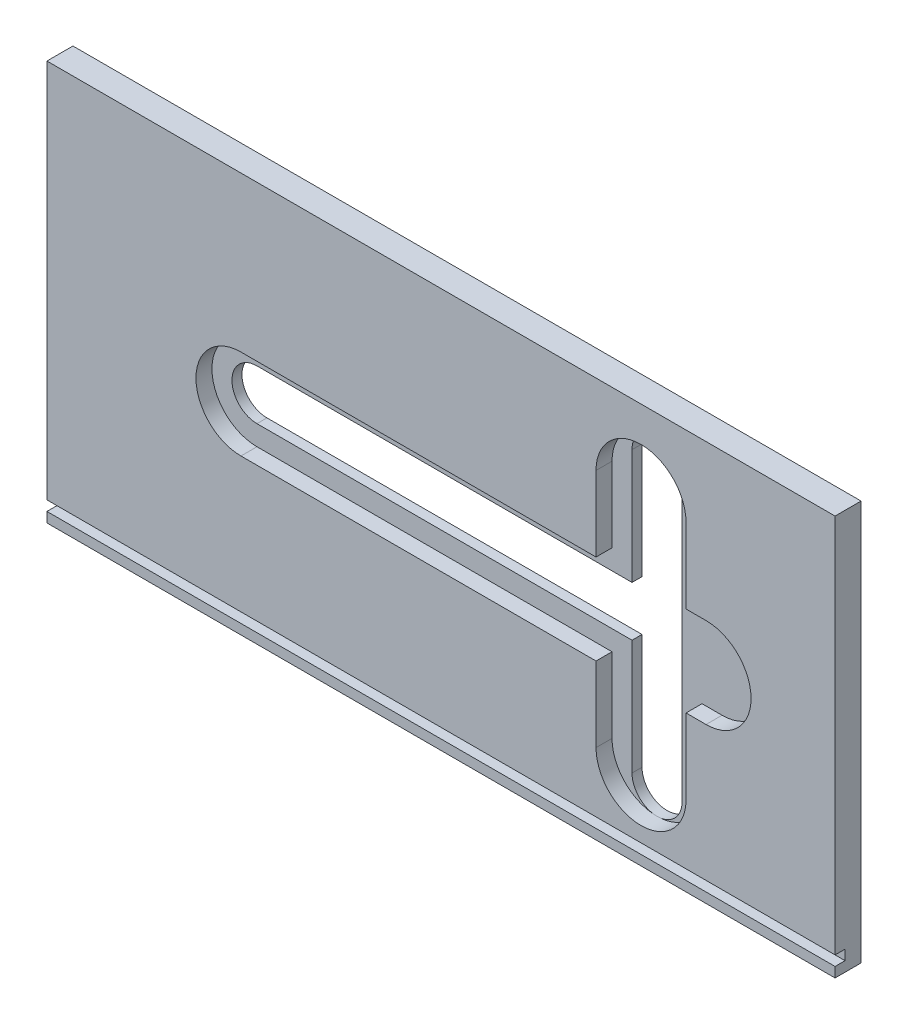
ISO-10303-21;
HEADER;
FILE_DESCRIPTION(('STEP AP214'),'2;1');
FILE_NAME('part.step','',(''),(''),'','','');
FILE_SCHEMA(('AUTOMOTIVE_DESIGN { 1 0 10303 214 1 1 1 1 }'));
ENDSEC;
DATA;
#1=APPLICATION_CONTEXT('core data for automotive mechanical design processes');
#2=APPLICATION_PROTOCOL_DEFINITION('international standard','automotive_design',2000,#1);
#3=PRODUCT_CONTEXT('',#1,'mechanical');
#4=PRODUCT('Part','Part','',(#3));
#5=PRODUCT_RELATED_PRODUCT_CATEGORY('part','',(#4));
#6=PRODUCT_DEFINITION_FORMATION('','',#4);
#7=PRODUCT_DEFINITION_CONTEXT('part definition',#1,'design');
#8=PRODUCT_DEFINITION('design','',#6,#7);
#9=PRODUCT_DEFINITION_SHAPE('','',#8);
#10=(LENGTH_UNIT() NAMED_UNIT(*) SI_UNIT(.MILLI.,.METRE.));
#11=(NAMED_UNIT(*) PLANE_ANGLE_UNIT() SI_UNIT($,.RADIAN.));
#12=(NAMED_UNIT(*) SI_UNIT($,.STERADIAN.) SOLID_ANGLE_UNIT());
#13=UNCERTAINTY_MEASURE_WITH_UNIT(LENGTH_MEASURE(1.E-05),#10,'distance_accuracy_value','');
#14=(GEOMETRIC_REPRESENTATION_CONTEXT(3) GLOBAL_UNCERTAINTY_ASSIGNED_CONTEXT((#13)) GLOBAL_UNIT_ASSIGNED_CONTEXT((#10,
#11,#12)) REPRESENTATION_CONTEXT('',''));
#15=CARTESIAN_POINT('',(0.,0.,0.));
#16=DIRECTION('',(0.,0.,1.));
#17=DIRECTION('',(1.,0.,0.));
#18=AXIS2_PLACEMENT_3D('',#15,#16,#17);
#19=CARTESIAN_POINT('',(27.7198682766191,61.5071428571429,0.));
#20=DIRECTION('',(0.,0.,1.));
#21=DIRECTION('',(1.,0.,0.));
#22=AXIS2_PLACEMENT_3D('',#19,#20,#21);
#23=CYLINDRICAL_SURFACE('',#22,12.5);
#24=CARTESIAN_POINT('',(27.7198682766191,61.5071428571429,5.));
#25=DIRECTION('',(0.,0.,1.));
#26=DIRECTION('',(1.,0.,0.));
#27=AXIS2_PLACEMENT_3D('',#24,#25,#26);
#28=CIRCLE('',#27,12.5);
#29=CARTESIAN_POINT('',(27.7198682766191,49.0071428571429,5.));
#30=VERTEX_POINT('',#29);
#31=CARTESIAN_POINT('',(27.7198682766191,74.0071428571429,5.));
#32=VERTEX_POINT('',#31);
#33=EDGE_CURVE('E330',#30,#32,#28,.F.);
#34=ORIENTED_EDGE('',*,*,#33,.F.);
#35=DIRECTION('',(0.,0.,1.));
#36=VECTOR('',#35,1.);
#37=CARTESIAN_POINT('',(27.7198682766191,49.0071428571429,0.));
#38=LINE('',#37,#36);
#39=CARTESIAN_POINT('',(27.7198682766191,49.0071428571429,0.));
#40=VERTEX_POINT('',#39);
#41=EDGE_CURVE('E366',#40,#30,#38,.T.);
#42=ORIENTED_EDGE('',*,*,#41,.F.);
#43=CARTESIAN_POINT('',(27.7198682766191,61.5071428571429,0.));
#44=DIRECTION('',(0.,0.,1.));
#45=DIRECTION('',(-1.,0.,0.));
#46=AXIS2_PLACEMENT_3D('',#43,#44,#45);
#47=CIRCLE('',#46,12.5);
#48=CARTESIAN_POINT('',(27.7198682766191,74.0071428571429,0.));
#49=VERTEX_POINT('',#48);
#50=EDGE_CURVE('E342',#49,#40,#47,.T.);
#51=ORIENTED_EDGE('',*,*,#50,.F.);
#52=DIRECTION('',(0.,0.,1.));
#53=VECTOR('',#52,1.);
#54=CARTESIAN_POINT('',(27.7198682766191,74.0071428571429,0.));
#55=LINE('',#54,#53);
#56=EDGE_CURVE('E367',#49,#32,#55,.T.);
#57=ORIENTED_EDGE('',*,*,#56,.T.);
#58=EDGE_LOOP('',(#34,#42,#51,#57));
#59=FACE_BOUND('',#58,.T.);
#60=ADVANCED_FACE('F33',(#59),#23,.F.);
#61=CARTESIAN_POINT('',(27.7198682766191,74.0071428571429,0.));
#62=DIRECTION('',(0.,1.,0.));
#63=DIRECTION('',(0.,0.,1.));
#64=AXIS2_PLACEMENT_3D('',#61,#62,#63);
#65=PLANE('',#64);
#66=DIRECTION('',(1.,0.,0.));
#67=VECTOR('',#66,1.);
#68=CARTESIAN_POINT('',(27.7198682766191,74.0071428571429,5.));
#69=LINE('',#68,#67);
#70=CARTESIAN_POINT('',(215.219868276619,74.0071428571429,5.));
#71=VERTEX_POINT('',#70);
#72=EDGE_CURVE('E337',#32,#71,#69,.T.);
#73=ORIENTED_EDGE('',*,*,#72,.F.);
#74=ORIENTED_EDGE('',*,*,#56,.F.);
#75=DIRECTION('',(-1.,0.,0.));
#76=VECTOR('',#75,1.);
#77=CARTESIAN_POINT('',(27.7198682766191,74.0071428571429,0.));
#78=LINE('',#77,#76);
#79=CARTESIAN_POINT('',(215.219868276619,74.0071428571429,0.));
#80=VERTEX_POINT('',#79);
#81=EDGE_CURVE('E363',#80,#49,#78,.T.);
#82=ORIENTED_EDGE('',*,*,#81,.F.);
#83=DIRECTION('',(0.,0.,1.));
#84=VECTOR('',#83,1.);
#85=CARTESIAN_POINT('',(215.219868276619,74.0071428571429,0.));
#86=LINE('',#85,#84);
#87=EDGE_CURVE('E371',#80,#71,#86,.T.);
#88=ORIENTED_EDGE('',*,*,#87,.T.);
#89=EDGE_LOOP('',(#73,#74,#82,#88));
#90=FACE_BOUND('',#89,.T.);
#91=ADVANCED_FACE('F499',(#90),#65,.F.);
#92=CARTESIAN_POINT('',(215.219868276619,131.507142857143,0.));
#93=DIRECTION('',(-1.,0.,0.));
#94=DIRECTION('',(0.,-1.,0.));
#95=AXIS2_PLACEMENT_3D('',#92,#93,#94);
#96=PLANE('',#95);
#97=DIRECTION('',(0.,1.,0.));
#98=VECTOR('',#97,1.);
#99=CARTESIAN_POINT('',(215.219868276619,131.507142857143,5.));
#100=LINE('',#99,#98);
#101=CARTESIAN_POINT('',(215.219868276619,131.507142857143,5.));
#102=VERTEX_POINT('',#101);
#103=EDGE_CURVE('E340',#71,#102,#100,.T.);
#104=ORIENTED_EDGE('',*,*,#103,.F.);
#105=ORIENTED_EDGE('',*,*,#87,.F.);
#106=DIRECTION('',(0.,-1.,0.));
#107=VECTOR('',#106,1.);
#108=CARTESIAN_POINT('',(215.219868276619,131.507142857143,0.));
#109=LINE('',#108,#107);
#110=CARTESIAN_POINT('',(215.219868276619,131.507142857143,0.));
#111=VERTEX_POINT('',#110);
#112=EDGE_CURVE('E360',#111,#80,#109,.T.);
#113=ORIENTED_EDGE('',*,*,#112,.F.);
#114=DIRECTION('',(0.,0.,1.));
#115=VECTOR('',#114,1.);
#116=CARTESIAN_POINT('',(215.219868276619,131.507142857143,0.));
#117=LINE('',#116,#115);
#118=EDGE_CURVE('E374',#111,#102,#117,.T.);
#119=ORIENTED_EDGE('',*,*,#118,.T.);
#120=EDGE_LOOP('',(#104,#105,#113,#119));
#121=FACE_BOUND('',#120,.T.);
#122=ADVANCED_FACE('F505',(#121),#96,.F.);
#123=CARTESIAN_POINT('',(227.719868276619,131.507142857143,0.));
#124=DIRECTION('',(0.,0.,1.));
#125=DIRECTION('',(1.,0.,0.));
#126=AXIS2_PLACEMENT_3D('',#123,#124,#125);
#127=CYLINDRICAL_SURFACE('',#126,12.5);
#128=CARTESIAN_POINT('',(227.719868276619,131.507142857143,5.));
#129=DIRECTION('',(0.,0.,1.));
#130=DIRECTION('',(1.,0.,0.));
#131=AXIS2_PLACEMENT_3D('',#128,#129,#130);
#132=CIRCLE('',#131,12.5);
#133=CARTESIAN_POINT('',(227.719868276619,144.007142857143,5.));
#134=VERTEX_POINT('',#133);
#135=CARTESIAN_POINT('',(240.219868276619,131.507142857143,5.));
#136=VERTEX_POINT('',#135);
#137=EDGE_CURVE('E335',#134,#136,#132,.F.);
#138=ORIENTED_EDGE('',*,*,#137,.F.);
#139=EDGE_CURVE('E338',#102,#134,#132,.F.);
#140=ORIENTED_EDGE('',*,*,#139,.F.);
#141=ORIENTED_EDGE('',*,*,#118,.F.);
#142=CARTESIAN_POINT('',(227.719868276619,131.507142857143,0.));
#143=DIRECTION('',(0.,0.,1.));
#144=DIRECTION('',(-1.,0.,0.));
#145=AXIS2_PLACEMENT_3D('',#142,#143,#144);
#146=CIRCLE('',#145,12.5);
#147=CARTESIAN_POINT('',(240.219868276619,131.507142857143,0.));
#148=VERTEX_POINT('',#147);
#149=EDGE_CURVE('E357',#148,#111,#146,.T.);
#150=ORIENTED_EDGE('',*,*,#149,.F.);
#151=DIRECTION('',(0.,0.,1.));
#152=VECTOR('',#151,1.);
#153=CARTESIAN_POINT('',(240.219868276619,131.507142857143,0.));
#154=LINE('',#153,#152);
#155=EDGE_CURVE('E377',#148,#136,#154,.T.);
#156=ORIENTED_EDGE('',*,*,#155,.T.);
#157=EDGE_LOOP('',(#138,#140,#141,#150,#156));
#158=FACE_BOUND('',#157,.T.);
#159=ADVANCED_FACE('F676',(#158),#127,.F.);
#160=CARTESIAN_POINT('',(240.219868276619,131.507142857143,0.));
#161=DIRECTION('',(1.,0.,0.));
#162=DIRECTION('',(0.,0.,-1.));
#163=AXIS2_PLACEMENT_3D('',#160,#161,#162);
#164=PLANE('',#163);
#165=DIRECTION('',(0.,-1.,0.));
#166=VECTOR('',#165,1.);
#167=CARTESIAN_POINT('',(240.219868276619,131.507142857143,5.));
#168=LINE('',#167,#166);
#169=CARTESIAN_POINT('',(240.219868276619,-8.49285714285714,5.));
#170=VERTEX_POINT('',#169);
#171=EDGE_CURVE('E333',#136,#170,#168,.T.);
#172=ORIENTED_EDGE('',*,*,#171,.F.);
#173=ORIENTED_EDGE('',*,*,#155,.F.);
#174=DIRECTION('',(0.,1.,0.));
#175=VECTOR('',#174,1.);
#176=CARTESIAN_POINT('',(240.219868276619,131.507142857143,0.));
#177=LINE('',#176,#175);
#178=CARTESIAN_POINT('',(240.219868276619,-8.49285714285713,0.));
#179=VERTEX_POINT('',#178);
#180=EDGE_CURVE('E354',#179,#148,#177,.T.);
#181=ORIENTED_EDGE('',*,*,#180,.F.);
#182=DIRECTION('',(0.,0.,1.));
#183=VECTOR('',#182,1.);
#184=CARTESIAN_POINT('',(240.219868276619,-8.49285714285713,0.));
#185=LINE('',#184,#183);
#186=EDGE_CURVE('E380',#179,#170,#185,.T.);
#187=ORIENTED_EDGE('',*,*,#186,.T.);
#188=EDGE_LOOP('',(#172,#173,#181,#187));
#189=FACE_BOUND('',#188,.T.);
#190=ADVANCED_FACE('F685',(#189),#164,.F.);
#191=CARTESIAN_POINT('',(227.719868276619,-8.49285714285714,0.));
#192=DIRECTION('',(0.,0.,1.));
#193=DIRECTION('',(1.,0.,0.));
#194=AXIS2_PLACEMENT_3D('',#191,#192,#193);
#195=CYLINDRICAL_SURFACE('',#194,12.5);
#196=CARTESIAN_POINT('',(227.719868276619,-8.49285714285714,5.));
#197=DIRECTION('',(0.,0.,1.));
#198=DIRECTION('',(1.,0.,0.));
#199=AXIS2_PLACEMENT_3D('',#196,#197,#198);
#200=CIRCLE('',#199,12.5);
#201=CARTESIAN_POINT('',(227.719868276619,-20.9928571428572,5.));
#202=VERTEX_POINT('',#201);
#203=CARTESIAN_POINT('',(215.219868276619,-8.49285714285713,5.));
#204=VERTEX_POINT('',#203);
#205=EDGE_CURVE('E328',#202,#204,#200,.F.);
#206=ORIENTED_EDGE('',*,*,#205,.F.);
#207=EDGE_CURVE('E331',#170,#202,#200,.F.);
#208=ORIENTED_EDGE('',*,*,#207,.F.);
#209=ORIENTED_EDGE('',*,*,#186,.F.);
#210=CARTESIAN_POINT('',(227.719868276619,-8.49285714285714,0.));
#211=DIRECTION('',(0.,0.,1.));
#212=DIRECTION('',(1.,0.,0.));
#213=AXIS2_PLACEMENT_3D('',#210,#211,#212);
#214=CIRCLE('',#213,12.5);
#215=CARTESIAN_POINT('',(215.219868276619,-8.49285714285713,0.));
#216=VERTEX_POINT('',#215);
#217=EDGE_CURVE('E351',#216,#179,#214,.T.);
#218=ORIENTED_EDGE('',*,*,#217,.F.);
#219=DIRECTION('',(0.,0.,1.));
#220=VECTOR('',#219,1.);
#221=CARTESIAN_POINT('',(215.219868276619,-8.49285714285713,0.));
#222=LINE('',#221,#220);
#223=EDGE_CURVE('E383',#216,#204,#222,.T.);
#224=ORIENTED_EDGE('',*,*,#223,.T.);
#225=EDGE_LOOP('',(#206,#208,#209,#218,#224));
#226=FACE_BOUND('',#225,.T.);
#227=ADVANCED_FACE('F694',(#226),#195,.F.);
#228=CARTESIAN_POINT('',(215.219868276619,49.0071428571429,0.));
#229=DIRECTION('',(-1.,0.,0.));
#230=DIRECTION('',(0.,-1.,0.));
#231=AXIS2_PLACEMENT_3D('',#228,#229,#230);
#232=PLANE('',#231);
#233=DIRECTION('',(0.,1.,0.));
#234=VECTOR('',#233,1.);
#235=CARTESIAN_POINT('',(215.219868276619,49.0071428571429,5.));
#236=LINE('',#235,#234);
#237=CARTESIAN_POINT('',(215.219868276619,49.0071428571429,5.));
#238=VERTEX_POINT('',#237);
#239=EDGE_CURVE('E55',#204,#238,#236,.T.);
#240=ORIENTED_EDGE('',*,*,#239,.F.);
#241=ORIENTED_EDGE('',*,*,#223,.F.);
#242=DIRECTION('',(0.,-1.,0.));
#243=VECTOR('',#242,1.);
#244=CARTESIAN_POINT('',(215.219868276619,49.0071428571429,0.));
#245=LINE('',#244,#243);
#246=CARTESIAN_POINT('',(215.219868276619,49.0071428571429,0.));
#247=VERTEX_POINT('',#246);
#248=EDGE_CURVE('E348',#247,#216,#245,.T.);
#249=ORIENTED_EDGE('',*,*,#248,.F.);
#250=DIRECTION('',(0.,0.,1.));
#251=VECTOR('',#250,1.);
#252=CARTESIAN_POINT('',(215.219868276619,49.0071428571429,0.));
#253=LINE('',#252,#251);
#254=EDGE_CURVE('E386',#247,#238,#253,.T.);
#255=ORIENTED_EDGE('',*,*,#254,.T.);
#256=EDGE_LOOP('',(#240,#241,#249,#255));
#257=FACE_BOUND('',#256,.T.);
#258=ADVANCED_FACE('F491',(#257),#232,.F.);
#259=CARTESIAN_POINT('',(27.7198682766191,49.0071428571429,0.));
#260=DIRECTION('',(0.,-1.,0.));
#261=DIRECTION('',(0.,0.,-1.));
#262=AXIS2_PLACEMENT_3D('',#259,#260,#261);
#263=PLANE('',#262);
#264=DIRECTION('',(-1.,0.,0.));
#265=VECTOR('',#264,1.);
#266=CARTESIAN_POINT('',(27.7198682766191,49.0071428571429,5.));
#267=LINE('',#266,#265);
#268=EDGE_CURVE('E11',#238,#30,#267,.T.);
#269=ORIENTED_EDGE('',*,*,#268,.F.);
#270=ORIENTED_EDGE('',*,*,#254,.F.);
#271=DIRECTION('',(1.,0.,0.));
#272=VECTOR('',#271,1.);
#273=CARTESIAN_POINT('',(27.7198682766191,49.0071428571429,0.));
#274=LINE('',#273,#272);
#275=EDGE_CURVE('E345',#40,#247,#274,.T.);
#276=ORIENTED_EDGE('',*,*,#275,.F.);
#277=ORIENTED_EDGE('',*,*,#41,.T.);
#278=EDGE_LOOP('',(#269,#270,#276,#277));
#279=FACE_BOUND('',#278,.T.);
#280=ADVANCED_FACE('F485',(#279),#263,.F.);
#281=CARTESIAN_POINT('',(0.,0.,13.));
#282=DIRECTION('',(0.,0.,1.));
#283=DIRECTION('',(1.,0.,0.));
#284=AXIS2_PLACEMENT_3D('',#281,#282,#283);
#285=PLANE('',#284);
#286=DIRECTION('',(1.,0.,0.));
#287=VECTOR('',#286,1.);
#288=CARTESIAN_POINT('',(324.719868276619,-33.4928571428571,13.));
#289=LINE('',#288,#287);
#290=CARTESIAN_POINT('',(-69.2801317233809,-33.4928571428572,13.));
#291=VERTEX_POINT('',#290);
#292=CARTESIAN_POINT('',(324.719868276619,-33.4928571428571,13.));
#293=VERTEX_POINT('',#292);
#294=EDGE_CURVE('E395',#291,#293,#289,.T.);
#295=ORIENTED_EDGE('',*,*,#294,.F.);
#296=DIRECTION('',(0.,-1.,0.));
#297=VECTOR('',#296,1.);
#298=CARTESIAN_POINT('',(-69.2801317233809,161.507142857143,13.));
#299=LINE('',#298,#297);
#300=CARTESIAN_POINT('',(-69.2801317233809,-38.4928571428571,13.));
#301=VERTEX_POINT('',#300);
#302=EDGE_CURVE('E420',#291,#301,#299,.T.);
#303=ORIENTED_EDGE('',*,*,#302,.T.);
#304=DIRECTION('',(1.,0.,0.));
#305=VECTOR('',#304,1.);
#306=CARTESIAN_POINT('',(-69.2801317233809,-38.4928571428571,13.));
#307=LINE('',#306,#305);
#308=CARTESIAN_POINT('',(324.719868276619,-38.4928571428571,13.));
#309=VERTEX_POINT('',#308);
#310=EDGE_CURVE('E419',#301,#309,#307,.T.);
#311=ORIENTED_EDGE('',*,*,#310,.T.);
#312=DIRECTION('',(0.,1.,0.));
#313=VECTOR('',#312,1.);
#314=CARTESIAN_POINT('',(324.719868276619,161.507142857143,13.));
#315=LINE('',#314,#313);
#316=EDGE_CURVE('E423',#309,#293,#315,.T.);
#317=ORIENTED_EDGE('',*,*,#316,.T.);
#318=EDGE_LOOP('',(#295,#303,#311,#317));
#319=FACE_BOUND('',#318,.T.);
#320=ADVANCED_FACE('F483',(#319),#285,.T.);
#321=CARTESIAN_POINT('',(-69.2801317233809,161.507142857143,13.));
#322=DIRECTION('',(1.,0.,0.));
#323=DIRECTION('',(0.,1.,0.));
#324=AXIS2_PLACEMENT_3D('',#321,#322,#323);
#325=PLANE('',#324);
#326=ORIENTED_EDGE('',*,*,#302,.F.);
#327=DIRECTION('',(0.,0.,1.));
#328=VECTOR('',#327,1.);
#329=CARTESIAN_POINT('',(-69.2801317233809,-33.4928571428572,8.));
#330=LINE('',#329,#328);
#331=CARTESIAN_POINT('',(-69.2801317233809,-33.4928571428572,8.));
#332=VERTEX_POINT('',#331);
#333=EDGE_CURVE('E410',#332,#291,#330,.T.);
#334=ORIENTED_EDGE('',*,*,#333,.F.);
#335=DIRECTION('',(0.,-1.,0.));
#336=VECTOR('',#335,1.);
#337=CARTESIAN_POINT('',(-69.2801317233809,-33.4928571428572,8.));
#338=LINE('',#337,#336);
#339=CARTESIAN_POINT('',(-69.2801317233809,-28.4928571428572,8.));
#340=VERTEX_POINT('',#339);
#341=EDGE_CURVE('E398',#340,#332,#338,.T.);
#342=ORIENTED_EDGE('',*,*,#341,.F.);
#343=DIRECTION('',(0.,0.,1.));
#344=VECTOR('',#343,1.);
#345=CARTESIAN_POINT('',(-69.2801317233809,-28.4928571428572,8.));
#346=LINE('',#345,#344);
#347=CARTESIAN_POINT('',(-69.2801317233809,-28.4928571428572,13.));
#348=VERTEX_POINT('',#347);
#349=EDGE_CURVE('E412',#340,#348,#346,.T.);
#350=ORIENTED_EDGE('',*,*,#349,.T.);
#351=CARTESIAN_POINT('',(-69.2801317233809,161.507142857143,13.));
#352=VERTEX_POINT('',#351);
#353=EDGE_CURVE('E416',#352,#348,#299,.T.);
#354=ORIENTED_EDGE('',*,*,#353,.F.);
#355=DIRECTION('',(0.,0.,-1.));
#356=VECTOR('',#355,1.);
#357=CARTESIAN_POINT('',(-69.2801317233809,161.507142857143,13.));
#358=LINE('',#357,#356);
#359=CARTESIAN_POINT('',(-69.2801317233809,161.507142857143,0.));
#360=VERTEX_POINT('',#359);
#361=EDGE_CURVE('E428',#352,#360,#358,.T.);
#362=ORIENTED_EDGE('',*,*,#361,.T.);
#363=DIRECTION('',(0.,-1.,0.));
#364=VECTOR('',#363,1.);
#365=CARTESIAN_POINT('',(-69.2801317233809,161.507142857143,0.));
#366=LINE('',#365,#364);
#367=CARTESIAN_POINT('',(-69.2801317233809,-38.4928571428571,0.));
#368=VERTEX_POINT('',#367);
#369=EDGE_CURVE('E409',#360,#368,#366,.T.);
#370=ORIENTED_EDGE('',*,*,#369,.T.);
#371=DIRECTION('',(0.,0.,-1.));
#372=VECTOR('',#371,1.);
#373=CARTESIAN_POINT('',(-69.2801317233809,-38.4928571428571,13.));
#374=LINE('',#373,#372);
#375=EDGE_CURVE('E41',#301,#368,#374,.T.);
#376=ORIENTED_EDGE('',*,*,#375,.F.);
#377=EDGE_LOOP('',(#326,#334,#342,#350,#354,#362,#370,#376));
#378=FACE_BOUND('',#377,.T.);
#379=ADVANCED_FACE('F35',(#378),#325,.F.);
#380=CARTESIAN_POINT('',(-69.2801317233809,-38.4928571428571,13.));
#381=DIRECTION('',(0.,1.,0.));
#382=DIRECTION('',(0.,0.,1.));
#383=AXIS2_PLACEMENT_3D('',#380,#381,#382);
#384=PLANE('',#383);
#385=DIRECTION('',(1.,0.,0.));
#386=VECTOR('',#385,1.);
#387=CARTESIAN_POINT('',(-69.2801317233809,-38.4928571428571,0.));
#388=LINE('',#387,#386);
#389=CARTESIAN_POINT('',(324.719868276619,-38.4928571428571,0.));
#390=VERTEX_POINT('',#389);
#391=EDGE_CURVE('E431',#368,#390,#388,.T.);
#392=ORIENTED_EDGE('',*,*,#391,.T.);
#393=DIRECTION('',(0.,0.,-1.));
#394=VECTOR('',#393,1.);
#395=CARTESIAN_POINT('',(324.719868276619,-38.4928571428571,13.));
#396=LINE('',#395,#394);
#397=EDGE_CURVE('E442',#309,#390,#396,.T.);
#398=ORIENTED_EDGE('',*,*,#397,.F.);
#399=ORIENTED_EDGE('',*,*,#310,.F.);
#400=ORIENTED_EDGE('',*,*,#375,.T.);
#401=EDGE_LOOP('',(#392,#398,#399,#400));
#402=FACE_BOUND('',#401,.T.);
#403=ADVANCED_FACE('F448',(#402),#384,.F.);
#404=CARTESIAN_POINT('',(324.719868276619,161.507142857143,13.));
#405=DIRECTION('',(-1.,0.,0.));
#406=DIRECTION('',(0.,0.,1.));
#407=AXIS2_PLACEMENT_3D('',#404,#405,#406);
#408=PLANE('',#407);
#409=DIRECTION('',(0.,1.,0.));
#410=VECTOR('',#409,1.);
#411=CARTESIAN_POINT('',(324.719868276619,-33.4928571428571,8.));
#412=LINE('',#411,#410);
#413=CARTESIAN_POINT('',(324.719868276619,-33.4928571428571,8.));
#414=VERTEX_POINT('',#413);
#415=CARTESIAN_POINT('',(324.719868276619,-28.4928571428571,8.));
#416=VERTEX_POINT('',#415);
#417=EDGE_CURVE('E391',#414,#416,#412,.T.);
#418=ORIENTED_EDGE('',*,*,#417,.F.);
#419=DIRECTION('',(0.,0.,1.));
#420=VECTOR('',#419,1.);
#421=CARTESIAN_POINT('',(324.719868276619,-33.4928571428571,8.));
#422=LINE('',#421,#420);
#423=EDGE_CURVE('E406',#414,#293,#422,.T.);
#424=ORIENTED_EDGE('',*,*,#423,.T.);
#425=ORIENTED_EDGE('',*,*,#316,.F.);
#426=ORIENTED_EDGE('',*,*,#397,.T.);
#427=DIRECTION('',(0.,1.,0.));
#428=VECTOR('',#427,1.);
#429=CARTESIAN_POINT('',(324.719868276619,161.507142857143,0.));
#430=LINE('',#429,#428);
#431=CARTESIAN_POINT('',(324.719868276619,161.507142857143,0.));
#432=VERTEX_POINT('',#431);
#433=EDGE_CURVE('E433',#390,#432,#430,.T.);
#434=ORIENTED_EDGE('',*,*,#433,.T.);
#435=DIRECTION('',(0.,0.,-1.));
#436=VECTOR('',#435,1.);
#437=CARTESIAN_POINT('',(324.719868276619,161.507142857143,13.));
#438=LINE('',#437,#436);
#439=CARTESIAN_POINT('',(324.719868276619,161.507142857143,13.));
#440=VERTEX_POINT('',#439);
#441=EDGE_CURVE('E439',#440,#432,#438,.T.);
#442=ORIENTED_EDGE('',*,*,#441,.F.);
#443=CARTESIAN_POINT('',(324.719868276619,-28.4928571428572,13.));
#444=VERTEX_POINT('',#443);
#445=EDGE_CURVE('E422',#444,#440,#315,.T.);
#446=ORIENTED_EDGE('',*,*,#445,.F.);
#447=DIRECTION('',(0.,0.,1.));
#448=VECTOR('',#447,1.);
#449=CARTESIAN_POINT('',(324.719868276619,-28.4928571428571,8.));
#450=LINE('',#449,#448);
#451=EDGE_CURVE('E403',#416,#444,#450,.T.);
#452=ORIENTED_EDGE('',*,*,#451,.F.);
#453=EDGE_LOOP('',(#418,#424,#425,#426,#434,#442,#446,#452));
#454=FACE_BOUND('',#453,.T.);
#455=ADVANCED_FACE('F462',(#454),#408,.F.);
#456=CARTESIAN_POINT('',(-69.2801317233809,161.507142857143,13.));
#457=DIRECTION('',(0.,-1.,0.));
#458=DIRECTION('',(0.,0.,-1.));
#459=AXIS2_PLACEMENT_3D('',#456,#457,#458);
#460=PLANE('',#459);
#461=DIRECTION('',(-1.,0.,0.));
#462=VECTOR('',#461,1.);
#463=CARTESIAN_POINT('',(-69.2801317233809,161.507142857143,0.));
#464=LINE('',#463,#462);
#465=EDGE_CURVE('E435',#432,#360,#464,.T.);
#466=ORIENTED_EDGE('',*,*,#465,.T.);
#467=ORIENTED_EDGE('',*,*,#361,.F.);
#468=DIRECTION('',(-1.,0.,0.));
#469=VECTOR('',#468,1.);
#470=CARTESIAN_POINT('',(-69.2801317233809,161.507142857143,13.));
#471=LINE('',#470,#469);
#472=EDGE_CURVE('E426',#440,#352,#471,.T.);
#473=ORIENTED_EDGE('',*,*,#472,.F.);
#474=ORIENTED_EDGE('',*,*,#441,.T.);
#475=EDGE_LOOP('',(#466,#467,#473,#474));
#476=FACE_BOUND('',#475,.T.);
#477=ADVANCED_FACE('F467',(#476),#460,.F.);
#478=DIRECTION('',(-1.,0.,0.));
#479=VECTOR('',#478,1.);
#480=CARTESIAN_POINT('',(27.7198682766191,84.0071428571429,13.));
#481=LINE('',#480,#479);
#482=CARTESIAN_POINT('',(205.219868276619,84.0071428571429,13.));
#483=VERTEX_POINT('',#482);
#484=CARTESIAN_POINT('',(27.7198682766191,84.0071428571429,13.));
#485=VERTEX_POINT('',#484);
#486=EDGE_CURVE('E243',#483,#485,#481,.T.);
#487=ORIENTED_EDGE('',*,*,#486,.F.);
#488=DIRECTION('',(0.,-1.,0.));
#489=VECTOR('',#488,1.);
#490=CARTESIAN_POINT('',(205.219868276619,121.507142857143,13.));
#491=LINE('',#490,#489);
#492=CARTESIAN_POINT('',(205.219868276619,121.507142857143,13.));
#493=VERTEX_POINT('',#492);
#494=EDGE_CURVE('E246',#493,#483,#491,.T.);
#495=ORIENTED_EDGE('',*,*,#494,.F.);
#496=CARTESIAN_POINT('',(227.719868276619,121.507142857143,13.));
#497=DIRECTION('',(0.,0.,1.));
#498=DIRECTION('',(-1.,0.,0.));
#499=AXIS2_PLACEMENT_3D('',#496,#497,#498);
#500=CIRCLE('',#499,22.5);
#501=CARTESIAN_POINT('',(250.219868276619,121.507142857143,13.));
#502=VERTEX_POINT('',#501);
#503=EDGE_CURVE('E299',#502,#493,#500,.T.);
#504=ORIENTED_EDGE('',*,*,#503,.F.);
#505=DIRECTION('',(0.,1.,0.));
#506=VECTOR('',#505,1.);
#507=CARTESIAN_POINT('',(250.219868276619,84.0071428571429,13.));
#508=LINE('',#507,#506);
#509=CARTESIAN_POINT('',(250.219868276619,84.0071428571429,13.));
#510=VERTEX_POINT('',#509);
#511=EDGE_CURVE('E296',#510,#502,#508,.T.);
#512=ORIENTED_EDGE('',*,*,#511,.F.);
#513=DIRECTION('',(-1.,0.,0.));
#514=VECTOR('',#513,1.);
#515=CARTESIAN_POINT('',(250.219868276619,84.0071428571429,13.));
#516=LINE('',#515,#514);
#517=CARTESIAN_POINT('',(260.219868276619,84.0071428571429,13.));
#518=VERTEX_POINT('',#517);
#519=EDGE_CURVE('E293',#518,#510,#516,.T.);
#520=ORIENTED_EDGE('',*,*,#519,.F.);
#521=CARTESIAN_POINT('',(260.219868276619,61.5071428571429,13.));
#522=DIRECTION('',(0.,0.,1.));
#523=DIRECTION('',(-1.,0.,0.));
#524=AXIS2_PLACEMENT_3D('',#521,#522,#523);
#525=CIRCLE('',#524,22.5);
#526=CARTESIAN_POINT('',(260.219868276619,39.0071428571429,13.));
#527=VERTEX_POINT('',#526);
#528=EDGE_CURVE('E290',#527,#518,#525,.T.);
#529=ORIENTED_EDGE('',*,*,#528,.F.);
#530=DIRECTION('',(1.,0.,0.));
#531=VECTOR('',#530,1.);
#532=CARTESIAN_POINT('',(250.219868276619,39.0071428571429,13.));
#533=LINE('',#532,#531);
#534=CARTESIAN_POINT('',(250.219868276619,39.0071428571429,13.));
#535=VERTEX_POINT('',#534);
#536=EDGE_CURVE('E287',#535,#527,#533,.T.);
#537=ORIENTED_EDGE('',*,*,#536,.F.);
#538=DIRECTION('',(0.,1.,0.));
#539=VECTOR('',#538,1.);
#540=CARTESIAN_POINT('',(250.219868276619,1.5071428571428,13.));
#541=LINE('',#540,#539);
#542=CARTESIAN_POINT('',(250.219868276619,1.5071428571428,13.));
#543=VERTEX_POINT('',#542);
#544=EDGE_CURVE('E284',#543,#535,#541,.T.);
#545=ORIENTED_EDGE('',*,*,#544,.F.);
#546=CARTESIAN_POINT('',(227.719868276619,1.5071428571428,13.));
#547=DIRECTION('',(0.,0.,1.));
#548=DIRECTION('',(1.,0.,0.));
#549=AXIS2_PLACEMENT_3D('',#546,#547,#548);
#550=CIRCLE('',#549,22.5);
#551=CARTESIAN_POINT('',(205.219868276619,1.5071428571428,13.));
#552=VERTEX_POINT('',#551);
#553=EDGE_CURVE('E282',#552,#543,#550,.T.);
#554=ORIENTED_EDGE('',*,*,#553,.F.);
#555=DIRECTION('',(0.,-1.,0.));
#556=VECTOR('',#555,1.);
#557=CARTESIAN_POINT('',(205.219868276619,39.0071428571429,13.));
#558=LINE('',#557,#556);
#559=CARTESIAN_POINT('',(205.219868276619,39.0071428571429,13.));
#560=VERTEX_POINT('',#559);
#561=EDGE_CURVE('E279',#560,#552,#558,.T.);
#562=ORIENTED_EDGE('',*,*,#561,.F.);
#563=DIRECTION('',(1.,0.,0.));
#564=VECTOR('',#563,1.);
#565=CARTESIAN_POINT('',(27.7198682766191,39.0071428571429,13.));
#566=LINE('',#565,#564);
#567=CARTESIAN_POINT('',(27.7198682766191,39.0071428571429,13.));
#568=VERTEX_POINT('',#567);
#569=EDGE_CURVE('E277',#568,#560,#566,.T.);
#570=ORIENTED_EDGE('',*,*,#569,.F.);
#571=CARTESIAN_POINT('',(27.7198682766191,61.5071428571429,13.));
#572=DIRECTION('',(0.,0.,1.));
#573=DIRECTION('',(1.,0.,0.));
#574=AXIS2_PLACEMENT_3D('',#571,#572,#573);
#575=CIRCLE('',#574,22.5);
#576=EDGE_CURVE('E48',#485,#568,#575,.T.);
#577=ORIENTED_EDGE('',*,*,#576,.F.);
#578=EDGE_LOOP('',(#487,#495,#504,#512,#520,#529,#537,#545,#554,#562,#570,#577));
#579=FACE_BOUND('',#578,.T.);
#580=DIRECTION('',(-1.,0.,0.));
#581=VECTOR('',#580,1.);
#582=CARTESIAN_POINT('',(324.719868276619,-28.4928571428571,13.));
#583=LINE('',#582,#581);
#584=EDGE_CURVE('E370',#444,#348,#583,.T.);
#585=ORIENTED_EDGE('',*,*,#584,.F.);
#586=ORIENTED_EDGE('',*,*,#445,.T.);
#587=ORIENTED_EDGE('',*,*,#472,.T.);
#588=ORIENTED_EDGE('',*,*,#353,.T.);
#589=EDGE_LOOP('',(#585,#586,#587,#588));
#590=FACE_BOUND('',#589,.T.);
#591=ADVANCED_FACE('F470',(#579,#590),#285,.T.);
#592=CARTESIAN_POINT('',(0.,0.,0.));
#593=DIRECTION('',(0.,0.,1.));
#594=DIRECTION('',(1.,0.,0.));
#595=AXIS2_PLACEMENT_3D('',#592,#593,#594);
#596=PLANE('',#595);
#597=ORIENTED_EDGE('',*,*,#81,.T.);
#598=ORIENTED_EDGE('',*,*,#50,.T.);
#599=ORIENTED_EDGE('',*,*,#275,.T.);
#600=ORIENTED_EDGE('',*,*,#248,.T.);
#601=ORIENTED_EDGE('',*,*,#217,.T.);
#602=ORIENTED_EDGE('',*,*,#180,.T.);
#603=ORIENTED_EDGE('',*,*,#149,.T.);
#604=ORIENTED_EDGE('',*,*,#112,.T.);
#605=EDGE_LOOP('',(#597,#598,#599,#600,#601,#602,#603,#604));
#606=FACE_BOUND('',#605,.T.);
#607=ORIENTED_EDGE('',*,*,#369,.F.);
#608=ORIENTED_EDGE('',*,*,#465,.F.);
#609=ORIENTED_EDGE('',*,*,#433,.F.);
#610=ORIENTED_EDGE('',*,*,#391,.F.);
#611=EDGE_LOOP('',(#607,#608,#609,#610));
#612=FACE_BOUND('',#611,.T.);
#613=ADVANCED_FACE('F457',(#606,#612),#596,.F.);
#614=CARTESIAN_POINT('',(324.719868276619,-33.4928571428571,8.));
#615=DIRECTION('',(0.,-1.,0.));
#616=DIRECTION('',(1.,0.,0.));
#617=AXIS2_PLACEMENT_3D('',#614,#615,#616);
#618=PLANE('',#617);
#619=ORIENTED_EDGE('',*,*,#294,.T.);
#620=ORIENTED_EDGE('',*,*,#423,.F.);
#621=DIRECTION('',(1.,0.,0.));
#622=VECTOR('',#621,1.);
#623=CARTESIAN_POINT('',(324.719868276619,-33.4928571428571,8.));
#624=LINE('',#623,#622);
#625=EDGE_CURVE('E400',#332,#414,#624,.T.);
#626=ORIENTED_EDGE('',*,*,#625,.F.);
#627=ORIENTED_EDGE('',*,*,#333,.T.);
#628=EDGE_LOOP('',(#619,#620,#626,#627));
#629=FACE_BOUND('',#628,.T.);
#630=ADVANCED_FACE('F480',(#629),#618,.F.);
#631=CARTESIAN_POINT('',(324.719868276619,-28.4928571428571,8.));
#632=DIRECTION('',(0.,1.,0.));
#633=DIRECTION('',(-1.,0.,0.));
#634=AXIS2_PLACEMENT_3D('',#631,#632,#633);
#635=PLANE('',#634);
#636=ORIENTED_EDGE('',*,*,#584,.T.);
#637=ORIENTED_EDGE('',*,*,#349,.F.);
#638=DIRECTION('',(-1.,0.,0.));
#639=VECTOR('',#638,1.);
#640=CARTESIAN_POINT('',(324.719868276619,-28.4928571428571,8.));
#641=LINE('',#640,#639);
#642=EDGE_CURVE('E394',#416,#340,#641,.T.);
#643=ORIENTED_EDGE('',*,*,#642,.F.);
#644=ORIENTED_EDGE('',*,*,#451,.T.);
#645=EDGE_LOOP('',(#636,#637,#643,#644));
#646=FACE_BOUND('',#645,.T.);
#647=ADVANCED_FACE('F473',(#646),#635,.F.);
#648=CARTESIAN_POINT('',(0.,0.,8.));
#649=DIRECTION('',(0.,0.,1.));
#650=DIRECTION('',(1.,0.,0.));
#651=AXIS2_PLACEMENT_3D('',#648,#649,#650);
#652=PLANE('',#651);
#653=ORIENTED_EDGE('',*,*,#417,.T.);
#654=ORIENTED_EDGE('',*,*,#642,.T.);
#655=ORIENTED_EDGE('',*,*,#341,.T.);
#656=ORIENTED_EDGE('',*,*,#625,.T.);
#657=EDGE_LOOP('',(#653,#654,#655,#656));
#658=FACE_BOUND('',#657,.T.);
#659=ADVANCED_FACE('F476',(#658),#652,.T.);
#660=CARTESIAN_POINT('',(227.719868276619,121.507142857143,5.));
#661=DIRECTION('',(0.,0.,1.));
#662=DIRECTION('',(1.,0.,0.));
#663=AXIS2_PLACEMENT_3D('',#660,#661,#662);
#664=CYLINDRICAL_SURFACE('',#663,22.5);
#665=CARTESIAN_POINT('',(227.719868276619,121.507142857143,5.));
#666=DIRECTION('',(0.,0.,1.));
#667=DIRECTION('',(-1.,0.,0.));
#668=AXIS2_PLACEMENT_3D('',#665,#666,#667);
#669=CIRCLE('',#668,22.5);
#670=CARTESIAN_POINT('',(250.219868276619,121.507142857143,5.));
#671=VERTEX_POINT('',#670);
#672=EDGE_CURVE('E270',#671,#134,#669,.T.);
#673=ORIENTED_EDGE('',*,*,#672,.F.);
#674=DIRECTION('',(0.,0.,1.));
#675=VECTOR('',#674,1.);
#676=CARTESIAN_POINT('',(250.219868276619,121.507142857143,5.));
#677=LINE('',#676,#675);
#678=EDGE_CURVE('E310',#671,#502,#677,.T.);
#679=ORIENTED_EDGE('',*,*,#678,.T.);
#680=ORIENTED_EDGE('',*,*,#503,.T.);
#681=DIRECTION('',(0.,0.,1.));
#682=VECTOR('',#681,1.);
#683=CARTESIAN_POINT('',(205.219868276619,121.507142857143,5.));
#684=LINE('',#683,#682);
#685=CARTESIAN_POINT('',(205.219868276619,121.507142857143,5.));
#686=VERTEX_POINT('',#685);
#687=EDGE_CURVE('E307',#686,#493,#684,.T.);
#688=ORIENTED_EDGE('',*,*,#687,.F.);
#689=EDGE_CURVE('E269',#134,#686,#669,.T.);
#690=ORIENTED_EDGE('',*,*,#689,.F.);
#691=EDGE_LOOP('',(#673,#679,#680,#688,#690));
#692=FACE_BOUND('',#691,.T.);
#693=ADVANCED_FACE('F513',(#692),#664,.F.);
#694=CARTESIAN_POINT('',(227.719868276619,1.5071428571428,5.));
#695=DIRECTION('',(0.,0.,1.));
#696=DIRECTION('',(1.,0.,0.));
#697=AXIS2_PLACEMENT_3D('',#694,#695,#696);
#698=CYLINDRICAL_SURFACE('',#697,22.5);
#699=CARTESIAN_POINT('',(227.719868276619,1.5071428571428,5.));
#700=DIRECTION('',(0.,0.,1.));
#701=DIRECTION('',(1.,0.,0.));
#702=AXIS2_PLACEMENT_3D('',#699,#700,#701);
#703=CIRCLE('',#702,22.5);
#704=CARTESIAN_POINT('',(205.219868276619,1.5071428571428,5.));
#705=VERTEX_POINT('',#704);
#706=EDGE_CURVE('E251',#705,#202,#703,.T.);
#707=ORIENTED_EDGE('',*,*,#706,.F.);
#708=DIRECTION('',(0.,0.,1.));
#709=VECTOR('',#708,1.);
#710=CARTESIAN_POINT('',(205.219868276619,1.5071428571428,5.));
#711=LINE('',#710,#709);
#712=EDGE_CURVE('E324',#705,#552,#711,.T.);
#713=ORIENTED_EDGE('',*,*,#712,.T.);
#714=ORIENTED_EDGE('',*,*,#553,.T.);
#715=DIRECTION('',(0.,0.,1.));
#716=VECTOR('',#715,1.);
#717=CARTESIAN_POINT('',(250.219868276619,1.5071428571428,5.));
#718=LINE('',#717,#716);
#719=CARTESIAN_POINT('',(250.219868276619,1.5071428571428,5.));
#720=VERTEX_POINT('',#719);
#721=EDGE_CURVE('E321',#720,#543,#718,.T.);
#722=ORIENTED_EDGE('',*,*,#721,.F.);
#723=EDGE_CURVE('E250',#202,#720,#703,.T.);
#724=ORIENTED_EDGE('',*,*,#723,.F.);
#725=EDGE_LOOP('',(#707,#713,#714,#722,#724));
#726=FACE_BOUND('',#725,.T.);
#727=ADVANCED_FACE('F532',(#726),#698,.F.);
#728=CARTESIAN_POINT('',(27.7198682766191,61.5071428571429,5.));
#729=DIRECTION('',(0.,0.,1.));
#730=DIRECTION('',(1.,0.,0.));
#731=AXIS2_PLACEMENT_3D('',#728,#729,#730);
#732=PLANE('',#731);
#733=ORIENTED_EDGE('',*,*,#103,.T.);
#734=ORIENTED_EDGE('',*,*,#139,.T.);
#735=ORIENTED_EDGE('',*,*,#689,.T.);
#736=DIRECTION('',(0.,-1.,0.));
#737=VECTOR('',#736,1.);
#738=CARTESIAN_POINT('',(205.219868276619,121.507142857143,5.));
#739=LINE('',#738,#737);
#740=CARTESIAN_POINT('',(205.219868276619,84.0071428571429,5.));
#741=VERTEX_POINT('',#740);
#742=EDGE_CURVE('E273',#686,#741,#739,.T.);
#743=ORIENTED_EDGE('',*,*,#742,.T.);
#744=DIRECTION('',(-1.,0.,0.));
#745=VECTOR('',#744,1.);
#746=CARTESIAN_POINT('',(27.7198682766191,84.0071428571429,5.));
#747=LINE('',#746,#745);
#748=CARTESIAN_POINT('',(27.7198682766191,84.0071428571429,5.));
#749=VERTEX_POINT('',#748);
#750=EDGE_CURVE('E231',#741,#749,#747,.T.);
#751=ORIENTED_EDGE('',*,*,#750,.T.);
#752=CARTESIAN_POINT('',(27.7198682766191,61.5071428571429,5.));
#753=DIRECTION('',(0.,0.,1.));
#754=DIRECTION('',(1.,0.,0.));
#755=AXIS2_PLACEMENT_3D('',#752,#753,#754);
#756=CIRCLE('',#755,22.5);
#757=CARTESIAN_POINT('',(27.7198682766191,39.0071428571429,5.));
#758=VERTEX_POINT('',#757);
#759=EDGE_CURVE('E225',#749,#758,#756,.T.);
#760=ORIENTED_EDGE('',*,*,#759,.T.);
#761=DIRECTION('',(1.,0.,0.));
#762=VECTOR('',#761,1.);
#763=CARTESIAN_POINT('',(27.7198682766191,39.0071428571429,5.));
#764=LINE('',#763,#762);
#765=CARTESIAN_POINT('',(205.219868276619,39.0071428571429,5.));
#766=VERTEX_POINT('',#765);
#767=EDGE_CURVE('E234',#758,#766,#764,.T.);
#768=ORIENTED_EDGE('',*,*,#767,.T.);
#769=DIRECTION('',(0.,-1.,0.));
#770=VECTOR('',#769,1.);
#771=CARTESIAN_POINT('',(205.219868276619,39.0071428571429,5.));
#772=LINE('',#771,#770);
#773=EDGE_CURVE('E238',#766,#705,#772,.T.);
#774=ORIENTED_EDGE('',*,*,#773,.T.);
#775=ORIENTED_EDGE('',*,*,#706,.T.);
#776=ORIENTED_EDGE('',*,*,#205,.T.);
#777=ORIENTED_EDGE('',*,*,#239,.T.);
#778=ORIENTED_EDGE('',*,*,#268,.T.);
#779=ORIENTED_EDGE('',*,*,#33,.T.);
#780=ORIENTED_EDGE('',*,*,#72,.T.);
#781=EDGE_LOOP('',(#733,#734,#735,#743,#751,#760,#768,#774,#775,#776,#777,#778,#779,#780));
#782=FACE_BOUND('',#781,.T.);
#783=ADVANCED_FACE('F240',(#782),#732,.T.);
#784=ORIENTED_EDGE('',*,*,#137,.T.);
#785=ORIENTED_EDGE('',*,*,#171,.T.);
#786=ORIENTED_EDGE('',*,*,#207,.T.);
#787=ORIENTED_EDGE('',*,*,#723,.T.);
#788=DIRECTION('',(0.,1.,0.));
#789=VECTOR('',#788,1.);
#790=CARTESIAN_POINT('',(250.219868276619,1.5071428571428,5.));
#791=LINE('',#790,#789);
#792=CARTESIAN_POINT('',(250.219868276619,39.0071428571429,5.));
#793=VERTEX_POINT('',#792);
#794=EDGE_CURVE('E254',#720,#793,#791,.T.);
#795=ORIENTED_EDGE('',*,*,#794,.T.);
#796=DIRECTION('',(1.,0.,0.));
#797=VECTOR('',#796,1.);
#798=CARTESIAN_POINT('',(250.219868276619,39.0071428571429,5.));
#799=LINE('',#798,#797);
#800=CARTESIAN_POINT('',(260.219868276619,39.0071428571429,5.));
#801=VERTEX_POINT('',#800);
#802=EDGE_CURVE('E257',#793,#801,#799,.T.);
#803=ORIENTED_EDGE('',*,*,#802,.T.);
#804=CARTESIAN_POINT('',(260.219868276619,61.5071428571429,5.));
#805=DIRECTION('',(0.,0.,1.));
#806=DIRECTION('',(-1.,0.,0.));
#807=AXIS2_PLACEMENT_3D('',#804,#805,#806);
#808=CIRCLE('',#807,22.5);
#809=CARTESIAN_POINT('',(260.219868276619,84.0071428571429,5.));
#810=VERTEX_POINT('',#809);
#811=EDGE_CURVE('E260',#801,#810,#808,.T.);
#812=ORIENTED_EDGE('',*,*,#811,.T.);
#813=DIRECTION('',(-1.,0.,0.));
#814=VECTOR('',#813,1.);
#815=CARTESIAN_POINT('',(250.219868276619,84.0071428571429,5.));
#816=LINE('',#815,#814);
#817=CARTESIAN_POINT('',(250.219868276619,84.0071428571429,5.));
#818=VERTEX_POINT('',#817);
#819=EDGE_CURVE('E263',#810,#818,#816,.T.);
#820=ORIENTED_EDGE('',*,*,#819,.T.);
#821=DIRECTION('',(0.,1.,0.));
#822=VECTOR('',#821,1.);
#823=CARTESIAN_POINT('',(250.219868276619,84.0071428571429,5.));
#824=LINE('',#823,#822);
#825=EDGE_CURVE('E266',#818,#671,#824,.T.);
#826=ORIENTED_EDGE('',*,*,#825,.T.);
#827=ORIENTED_EDGE('',*,*,#672,.T.);
#828=EDGE_LOOP('',(#784,#785,#786,#787,#795,#803,#812,#820,#826,#827));
#829=FACE_BOUND('',#828,.T.);
#830=ADVANCED_FACE('F548',(#829),#732,.T.);
#831=CARTESIAN_POINT('',(27.7198682766191,61.5071428571429,5.));
#832=DIRECTION('',(0.,0.,1.));
#833=DIRECTION('',(1.,0.,0.));
#834=AXIS2_PLACEMENT_3D('',#831,#832,#833);
#835=CYLINDRICAL_SURFACE('',#834,22.5);
#836=ORIENTED_EDGE('',*,*,#576,.T.);
#837=DIRECTION('',(0.,0.,1.));
#838=VECTOR('',#837,1.);
#839=CARTESIAN_POINT('',(27.7198682766191,39.0071428571429,5.));
#840=LINE('',#839,#838);
#841=EDGE_CURVE('E221',#758,#568,#840,.T.);
#842=ORIENTED_EDGE('',*,*,#841,.F.);
#843=ORIENTED_EDGE('',*,*,#759,.F.);
#844=DIRECTION('',(0.,0.,1.));
#845=VECTOR('',#844,1.);
#846=CARTESIAN_POINT('',(27.7198682766191,84.0071428571429,5.));
#847=LINE('',#846,#845);
#848=EDGE_CURVE('E303',#749,#485,#847,.T.);
#849=ORIENTED_EDGE('',*,*,#848,.T.);
#850=EDGE_LOOP('',(#836,#842,#843,#849));
#851=FACE_BOUND('',#850,.T.);
#852=ADVANCED_FACE('F223',(#851),#835,.F.);
#853=CARTESIAN_POINT('',(27.7198682766191,84.0071428571429,5.));
#854=DIRECTION('',(0.,1.,0.));
#855=DIRECTION('',(0.,0.,1.));
#856=AXIS2_PLACEMENT_3D('',#853,#854,#855);
#857=PLANE('',#856);
#858=ORIENTED_EDGE('',*,*,#486,.T.);
#859=ORIENTED_EDGE('',*,*,#848,.F.);
#860=ORIENTED_EDGE('',*,*,#750,.F.);
#861=DIRECTION('',(0.,0.,1.));
#862=VECTOR('',#861,1.);
#863=CARTESIAN_POINT('',(205.219868276619,84.0071428571429,5.));
#864=LINE('',#863,#862);
#865=EDGE_CURVE('E305',#741,#483,#864,.T.);
#866=ORIENTED_EDGE('',*,*,#865,.T.);
#867=EDGE_LOOP('',(#858,#859,#860,#866));
#868=FACE_BOUND('',#867,.T.);
#869=ADVANCED_FACE('F561',(#868),#857,.F.);
#870=CARTESIAN_POINT('',(205.219868276619,121.507142857143,5.));
#871=DIRECTION('',(-1.,0.,0.));
#872=DIRECTION('',(0.,-1.,0.));
#873=AXIS2_PLACEMENT_3D('',#870,#871,#872);
#874=PLANE('',#873);
#875=ORIENTED_EDGE('',*,*,#494,.T.);
#876=ORIENTED_EDGE('',*,*,#865,.F.);
#877=ORIENTED_EDGE('',*,*,#742,.F.);
#878=ORIENTED_EDGE('',*,*,#687,.T.);
#879=EDGE_LOOP('',(#875,#876,#877,#878));
#880=FACE_BOUND('',#879,.T.);
#881=ADVANCED_FACE('F568',(#880),#874,.F.);
#882=CARTESIAN_POINT('',(250.219868276619,84.0071428571429,5.));
#883=DIRECTION('',(1.,0.,0.));
#884=DIRECTION('',(0.,0.,-1.));
#885=AXIS2_PLACEMENT_3D('',#882,#883,#884);
#886=PLANE('',#885);
#887=ORIENTED_EDGE('',*,*,#511,.T.);
#888=ORIENTED_EDGE('',*,*,#678,.F.);
#889=ORIENTED_EDGE('',*,*,#825,.F.);
#890=DIRECTION('',(0.,0.,1.));
#891=VECTOR('',#890,1.);
#892=CARTESIAN_POINT('',(250.219868276619,84.0071428571429,5.));
#893=LINE('',#892,#891);
#894=EDGE_CURVE('E313',#818,#510,#893,.T.);
#895=ORIENTED_EDGE('',*,*,#894,.T.);
#896=EDGE_LOOP('',(#887,#888,#889,#895));
#897=FACE_BOUND('',#896,.T.);
#898=ADVANCED_FACE('F576',(#897),#886,.F.);
#899=CARTESIAN_POINT('',(250.219868276619,84.0071428571429,5.));
#900=DIRECTION('',(0.,1.,0.));
#901=DIRECTION('',(0.,0.,1.));
#902=AXIS2_PLACEMENT_3D('',#899,#900,#901);
#903=PLANE('',#902);
#904=ORIENTED_EDGE('',*,*,#519,.T.);
#905=ORIENTED_EDGE('',*,*,#894,.F.);
#906=ORIENTED_EDGE('',*,*,#819,.F.);
#907=DIRECTION('',(0.,0.,1.));
#908=VECTOR('',#907,1.);
#909=CARTESIAN_POINT('',(260.219868276619,84.0071428571429,5.));
#910=LINE('',#909,#908);
#911=EDGE_CURVE('E315',#810,#518,#910,.T.);
#912=ORIENTED_EDGE('',*,*,#911,.T.);
#913=EDGE_LOOP('',(#904,#905,#906,#912));
#914=FACE_BOUND('',#913,.T.);
#915=ADVANCED_FACE('F584',(#914),#903,.F.);
#916=CARTESIAN_POINT('',(260.219868276619,61.5071428571429,5.));
#917=DIRECTION('',(0.,0.,1.));
#918=DIRECTION('',(1.,0.,0.));
#919=AXIS2_PLACEMENT_3D('',#916,#917,#918);
#920=CYLINDRICAL_SURFACE('',#919,22.5);
#921=ORIENTED_EDGE('',*,*,#528,.T.);
#922=ORIENTED_EDGE('',*,*,#911,.F.);
#923=ORIENTED_EDGE('',*,*,#811,.F.);
#924=DIRECTION('',(0.,0.,1.));
#925=VECTOR('',#924,1.);
#926=CARTESIAN_POINT('',(260.219868276619,39.0071428571429,5.));
#927=LINE('',#926,#925);
#928=EDGE_CURVE('E317',#801,#527,#927,.T.);
#929=ORIENTED_EDGE('',*,*,#928,.T.);
#930=EDGE_LOOP('',(#921,#922,#923,#929));
#931=FACE_BOUND('',#930,.T.);
#932=ADVANCED_FACE('F592',(#931),#920,.F.);
#933=CARTESIAN_POINT('',(250.219868276619,39.0071428571429,5.));
#934=DIRECTION('',(0.,-1.,0.));
#935=DIRECTION('',(0.,0.,-1.));
#936=AXIS2_PLACEMENT_3D('',#933,#934,#935);
#937=PLANE('',#936);
#938=ORIENTED_EDGE('',*,*,#536,.T.);
#939=ORIENTED_EDGE('',*,*,#928,.F.);
#940=ORIENTED_EDGE('',*,*,#802,.F.);
#941=DIRECTION('',(0.,0.,1.));
#942=VECTOR('',#941,1.);
#943=CARTESIAN_POINT('',(250.219868276619,39.0071428571429,5.));
#944=LINE('',#943,#942);
#945=EDGE_CURVE('E319',#793,#535,#944,.T.);
#946=ORIENTED_EDGE('',*,*,#945,.T.);
#947=EDGE_LOOP('',(#938,#939,#940,#946));
#948=FACE_BOUND('',#947,.T.);
#949=ADVANCED_FACE('F600',(#948),#937,.F.);
#950=CARTESIAN_POINT('',(250.219868276619,1.5071428571428,5.));
#951=DIRECTION('',(1.,0.,0.));
#952=DIRECTION('',(0.,0.,-1.));
#953=AXIS2_PLACEMENT_3D('',#950,#951,#952);
#954=PLANE('',#953);
#955=ORIENTED_EDGE('',*,*,#544,.T.);
#956=ORIENTED_EDGE('',*,*,#945,.F.);
#957=ORIENTED_EDGE('',*,*,#794,.F.);
#958=ORIENTED_EDGE('',*,*,#721,.T.);
#959=EDGE_LOOP('',(#955,#956,#957,#958));
#960=FACE_BOUND('',#959,.T.);
#961=ADVANCED_FACE('F608',(#960),#954,.F.);
#962=CARTESIAN_POINT('',(205.219868276619,39.0071428571429,5.));
#963=DIRECTION('',(-1.,0.,0.));
#964=DIRECTION('',(0.,-1.,0.));
#965=AXIS2_PLACEMENT_3D('',#962,#963,#964);
#966=PLANE('',#965);
#967=ORIENTED_EDGE('',*,*,#561,.T.);
#968=ORIENTED_EDGE('',*,*,#712,.F.);
#969=ORIENTED_EDGE('',*,*,#773,.F.);
#970=DIRECTION('',(0.,0.,1.));
#971=VECTOR('',#970,1.);
#972=CARTESIAN_POINT('',(205.219868276619,39.0071428571429,5.));
#973=LINE('',#972,#971);
#974=EDGE_CURVE('E230',#766,#560,#973,.T.);
#975=ORIENTED_EDGE('',*,*,#974,.T.);
#976=EDGE_LOOP('',(#967,#968,#969,#975));
#977=FACE_BOUND('',#976,.T.);
#978=ADVANCED_FACE('F616',(#977),#966,.F.);
#979=CARTESIAN_POINT('',(27.7198682766191,39.0071428571429,5.));
#980=DIRECTION('',(0.,-1.,0.));
#981=DIRECTION('',(0.,0.,-1.));
#982=AXIS2_PLACEMENT_3D('',#979,#980,#981);
#983=PLANE('',#982);
#984=ORIENTED_EDGE('',*,*,#569,.T.);
#985=ORIENTED_EDGE('',*,*,#974,.F.);
#986=ORIENTED_EDGE('',*,*,#767,.F.);
#987=ORIENTED_EDGE('',*,*,#841,.T.);
#988=EDGE_LOOP('',(#984,#985,#986,#987));
#989=FACE_BOUND('',#988,.T.);
#990=ADVANCED_FACE('F235',(#989),#983,.F.);
#991=CLOSED_SHELL('',(#60,#91,#122,#159,#190,#227,#258,#280,#320,#379,#403,#455,#477,#591,#613,
#630,#647,#659,#693,#727,#783,#830,#852,#869,#881,#898,#915,#932,#949,#961,#978,#990));
#992=MANIFOLD_SOLID_BREP('B2',#991);
#993=ADVANCED_BREP_SHAPE_REPRESENTATION('',(#18,#992),#14);
#994=SHAPE_DEFINITION_REPRESENTATION(#9,#993);
ENDSEC;
END-ISO-10303-21;
